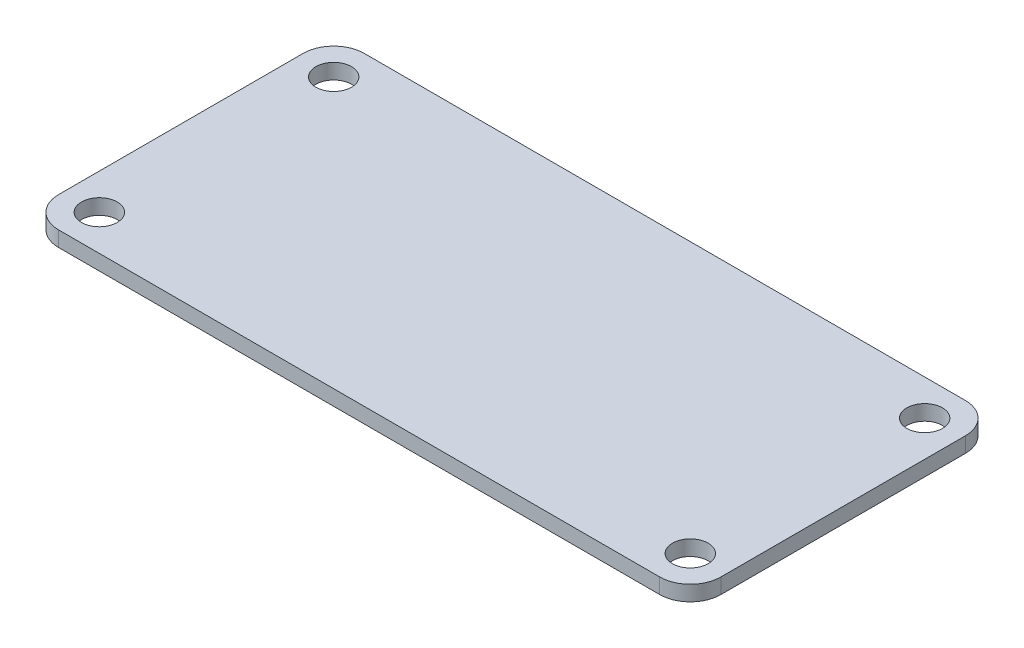
ISO-10303-21;
HEADER;
FILE_DESCRIPTION(('STEP AP214'),'2;1');
FILE_NAME('part.step','',(''),(''),'','','');
FILE_SCHEMA(('AUTOMOTIVE_DESIGN { 1 0 10303 214 1 1 1 1 }'));
ENDSEC;
DATA;
#1=APPLICATION_CONTEXT('core data for automotive mechanical design processes');
#2=APPLICATION_PROTOCOL_DEFINITION('international standard','automotive_design',2000,#1);
#3=PRODUCT_CONTEXT('',#1,'mechanical');
#4=PRODUCT('Part','Part','',(#3));
#5=PRODUCT_RELATED_PRODUCT_CATEGORY('part','',(#4));
#6=PRODUCT_DEFINITION_FORMATION('','',#4);
#7=PRODUCT_DEFINITION_CONTEXT('part definition',#1,'design');
#8=PRODUCT_DEFINITION('design','',#6,#7);
#9=PRODUCT_DEFINITION_SHAPE('','',#8);
#10=(LENGTH_UNIT() NAMED_UNIT(*) SI_UNIT(.MILLI.,.METRE.));
#11=(NAMED_UNIT(*) PLANE_ANGLE_UNIT() SI_UNIT($,.RADIAN.));
#12=(NAMED_UNIT(*) SI_UNIT($,.STERADIAN.) SOLID_ANGLE_UNIT());
#13=UNCERTAINTY_MEASURE_WITH_UNIT(LENGTH_MEASURE(1.E-05),#10,'distance_accuracy_value','');
#14=(GEOMETRIC_REPRESENTATION_CONTEXT(3) GLOBAL_UNCERTAINTY_ASSIGNED_CONTEXT((#13)) GLOBAL_UNIT_ASSIGNED_CONTEXT((#10,
#11,#12)) REPRESENTATION_CONTEXT('',''));
#15=CARTESIAN_POINT('',(0.,0.,0.));
#16=DIRECTION('',(0.,0.,1.));
#17=DIRECTION('',(1.,0.,0.));
#18=AXIS2_PLACEMENT_3D('',#15,#16,#17);
#19=CARTESIAN_POINT('',(0.,1.5,0.));
#20=DIRECTION('',(0.,1.,0.));
#21=DIRECTION('',(0.,0.,1.));
#22=AXIS2_PLACEMENT_3D('',#19,#20,#21);
#23=PLANE('',#22);
#24=CARTESIAN_POINT('',(29.,1.5,11.5));
#25=DIRECTION('',(0.,1.,0.));
#26=DIRECTION('',(0.,0.,1.));
#27=AXIS2_PLACEMENT_3D('',#24,#25,#26);
#28=CIRCLE('',#27,1.75);
#29=CARTESIAN_POINT('',(29.,1.5,13.25));
#30=VERTEX_POINT('',#29);
#31=EDGE_CURVE('E194',#30,#30,#28,.T.);
#32=ORIENTED_EDGE('',*,*,#31,.F.);
#33=EDGE_LOOP('',(#32));
#34=FACE_BOUND('',#33,.T.);
#35=CARTESIAN_POINT('',(-29.,1.5,-11.5));
#36=DIRECTION('',(0.,1.,0.));
#37=DIRECTION('',(0.,0.,1.));
#38=AXIS2_PLACEMENT_3D('',#35,#36,#37);
#39=CIRCLE('',#38,1.75);
#40=CARTESIAN_POINT('',(-29.,1.5,-9.75));
#41=VERTEX_POINT('',#40);
#42=EDGE_CURVE('E184',#41,#41,#39,.T.);
#43=ORIENTED_EDGE('',*,*,#42,.F.);
#44=EDGE_LOOP('',(#43));
#45=FACE_BOUND('',#44,.T.);
#46=DIRECTION('',(-1.,0.,0.));
#47=VECTOR('',#46,1.);
#48=CARTESIAN_POINT('',(-32.5,1.5,-15.));
#49=LINE('',#48,#47);
#50=CARTESIAN_POINT('',(29.5,1.5,-15.));
#51=VERTEX_POINT('',#50);
#52=CARTESIAN_POINT('',(-29.5,1.5,-15.));
#53=VERTEX_POINT('',#52);
#54=EDGE_CURVE('E175',#51,#53,#49,.T.);
#55=ORIENTED_EDGE('',*,*,#54,.T.);
#56=CARTESIAN_POINT('',(-29.5,1.5,-12.));
#57=DIRECTION('',(0.,1.,0.));
#58=DIRECTION('',(0.,0.,1.));
#59=AXIS2_PLACEMENT_3D('',#56,#57,#58);
#60=CIRCLE('',#59,3.);
#61=CARTESIAN_POINT('',(-32.5,1.5,-12.));
#62=VERTEX_POINT('',#61);
#63=EDGE_CURVE('E153',#53,#62,#60,.T.);
#64=ORIENTED_EDGE('',*,*,#63,.T.);
#65=DIRECTION('',(0.,0.,1.));
#66=VECTOR('',#65,1.);
#67=CARTESIAN_POINT('',(-32.5,1.5,-15.));
#68=LINE('',#67,#66);
#69=CARTESIAN_POINT('',(-32.5,1.5,12.));
#70=VERTEX_POINT('',#69);
#71=EDGE_CURVE('E123',#62,#70,#68,.T.);
#72=ORIENTED_EDGE('',*,*,#71,.T.);
#73=CARTESIAN_POINT('',(-29.5,1.5,12.));
#74=DIRECTION('',(0.,1.,0.));
#75=DIRECTION('',(0.,0.,1.));
#76=AXIS2_PLACEMENT_3D('',#73,#74,#75);
#77=CIRCLE('',#76,3.);
#78=CARTESIAN_POINT('',(-29.5,1.5,15.));
#79=VERTEX_POINT('',#78);
#80=EDGE_CURVE('E59',#70,#79,#77,.T.);
#81=ORIENTED_EDGE('',*,*,#80,.T.);
#82=DIRECTION('',(1.,0.,0.));
#83=VECTOR('',#82,1.);
#84=CARTESIAN_POINT('',(-32.5,1.5,15.));
#85=LINE('',#84,#83);
#86=CARTESIAN_POINT('',(29.5,1.5,15.));
#87=VERTEX_POINT('',#86);
#88=EDGE_CURVE('E139',#79,#87,#85,.T.);
#89=ORIENTED_EDGE('',*,*,#88,.T.);
#90=CARTESIAN_POINT('',(29.5,1.5,12.));
#91=DIRECTION('',(0.,1.,0.));
#92=DIRECTION('',(0.,0.,1.));
#93=AXIS2_PLACEMENT_3D('',#90,#91,#92);
#94=CIRCLE('',#93,3.);
#95=CARTESIAN_POINT('',(32.5,1.5,12.));
#96=VERTEX_POINT('',#95);
#97=EDGE_CURVE('E149',#87,#96,#94,.T.);
#98=ORIENTED_EDGE('',*,*,#97,.T.);
#99=DIRECTION('',(0.,0.,-1.));
#100=VECTOR('',#99,1.);
#101=CARTESIAN_POINT('',(32.5,1.5,-15.));
#102=LINE('',#101,#100);
#103=CARTESIAN_POINT('',(32.5,1.5,-12.));
#104=VERTEX_POINT('',#103);
#105=EDGE_CURVE('E133',#96,#104,#102,.T.);
#106=ORIENTED_EDGE('',*,*,#105,.T.);
#107=CARTESIAN_POINT('',(29.5,1.5,-12.));
#108=DIRECTION('',(0.,1.,0.));
#109=DIRECTION('',(0.,0.,1.));
#110=AXIS2_PLACEMENT_3D('',#107,#108,#109);
#111=CIRCLE('',#110,3.);
#112=EDGE_CURVE('E151',#104,#51,#111,.T.);
#113=ORIENTED_EDGE('',*,*,#112,.T.);
#114=EDGE_LOOP('',(#55,#64,#72,#81,#89,#98,#106,#113));
#115=FACE_BOUND('',#114,.T.);
#116=CARTESIAN_POINT('',(29.,1.5,-11.5));
#117=DIRECTION('',(0.,1.,0.));
#118=DIRECTION('',(0.,0.,-1.));
#119=AXIS2_PLACEMENT_3D('',#116,#117,#118);
#120=CIRCLE('',#119,1.75);
#121=CARTESIAN_POINT('',(29.,1.5,-13.25));
#122=VERTEX_POINT('',#121);
#123=EDGE_CURVE('E189',#122,#122,#120,.T.);
#124=ORIENTED_EDGE('',*,*,#123,.F.);
#125=EDGE_LOOP('',(#124));
#126=FACE_BOUND('',#125,.T.);
#127=CARTESIAN_POINT('',(-29.,1.5,11.5));
#128=DIRECTION('',(0.,1.,0.));
#129=DIRECTION('',(0.,0.,-1.));
#130=AXIS2_PLACEMENT_3D('',#127,#128,#129);
#131=CIRCLE('',#130,1.75);
#132=CARTESIAN_POINT('',(-29.,1.5,9.75));
#133=VERTEX_POINT('',#132);
#134=EDGE_CURVE('E200',#133,#133,#131,.T.);
#135=ORIENTED_EDGE('',*,*,#134,.F.);
#136=EDGE_LOOP('',(#135));
#137=FACE_BOUND('',#136,.T.);
#138=ADVANCED_FACE('F39',(#34,#45,#115,#126,#137),#23,.T.);
#139=CARTESIAN_POINT('',(0.,0.,0.));
#140=DIRECTION('',(0.,1.,0.));
#141=DIRECTION('',(0.,0.,1.));
#142=AXIS2_PLACEMENT_3D('',#139,#140,#141);
#143=PLANE('',#142);
#144=DIRECTION('',(0.,0.,1.));
#145=VECTOR('',#144,1.);
#146=CARTESIAN_POINT('',(-32.5,0.,-15.));
#147=LINE('',#146,#145);
#148=CARTESIAN_POINT('',(-32.5,0.,-12.));
#149=VERTEX_POINT('',#148);
#150=CARTESIAN_POINT('',(-32.5,0.,12.));
#151=VERTEX_POINT('',#150);
#152=EDGE_CURVE('E121',#149,#151,#147,.T.);
#153=ORIENTED_EDGE('',*,*,#152,.F.);
#154=CARTESIAN_POINT('',(-29.5,0.,-12.));
#155=DIRECTION('',(0.,1.,0.));
#156=DIRECTION('',(0.,0.,1.));
#157=AXIS2_PLACEMENT_3D('',#154,#155,#156);
#158=CIRCLE('',#157,3.);
#159=CARTESIAN_POINT('',(-29.5,0.,-15.));
#160=VERTEX_POINT('',#159);
#161=EDGE_CURVE('E104',#149,#160,#158,.F.);
#162=ORIENTED_EDGE('',*,*,#161,.T.);
#163=DIRECTION('',(-1.,0.,0.));
#164=VECTOR('',#163,1.);
#165=CARTESIAN_POINT('',(-32.5,0.,-15.));
#166=LINE('',#165,#164);
#167=CARTESIAN_POINT('',(29.5,0.,-15.));
#168=VERTEX_POINT('',#167);
#169=EDGE_CURVE('E131',#168,#160,#166,.T.);
#170=ORIENTED_EDGE('',*,*,#169,.F.);
#171=CARTESIAN_POINT('',(29.5,0.,-12.));
#172=DIRECTION('',(0.,1.,0.));
#173=DIRECTION('',(0.,0.,1.));
#174=AXIS2_PLACEMENT_3D('',#171,#172,#173);
#175=CIRCLE('',#174,3.);
#176=CARTESIAN_POINT('',(32.5,0.,-12.));
#177=VERTEX_POINT('',#176);
#178=EDGE_CURVE('E115',#168,#177,#175,.F.);
#179=ORIENTED_EDGE('',*,*,#178,.T.);
#180=DIRECTION('',(0.,0.,-1.));
#181=VECTOR('',#180,1.);
#182=CARTESIAN_POINT('',(32.5,0.,-15.));
#183=LINE('',#182,#181);
#184=CARTESIAN_POINT('',(32.5,0.,12.));
#185=VERTEX_POINT('',#184);
#186=EDGE_CURVE('E135',#185,#177,#183,.T.);
#187=ORIENTED_EDGE('',*,*,#186,.F.);
#188=CARTESIAN_POINT('',(29.5,0.,12.));
#189=DIRECTION('',(0.,1.,0.));
#190=DIRECTION('',(0.,0.,1.));
#191=AXIS2_PLACEMENT_3D('',#188,#189,#190);
#192=CIRCLE('',#191,3.);
#193=CARTESIAN_POINT('',(29.5,0.,15.));
#194=VERTEX_POINT('',#193);
#195=EDGE_CURVE('E142',#185,#194,#192,.F.);
#196=ORIENTED_EDGE('',*,*,#195,.T.);
#197=DIRECTION('',(1.,0.,0.));
#198=VECTOR('',#197,1.);
#199=CARTESIAN_POINT('',(-32.5,0.,15.));
#200=LINE('',#199,#198);
#201=CARTESIAN_POINT('',(-29.5,0.,15.));
#202=VERTEX_POINT('',#201);
#203=EDGE_CURVE('E130',#202,#194,#200,.T.);
#204=ORIENTED_EDGE('',*,*,#203,.F.);
#205=CARTESIAN_POINT('',(-29.5,0.,12.));
#206=DIRECTION('',(0.,1.,0.));
#207=DIRECTION('',(0.,0.,1.));
#208=AXIS2_PLACEMENT_3D('',#205,#206,#207);
#209=CIRCLE('',#208,3.);
#210=EDGE_CURVE('E124',#202,#151,#209,.F.);
#211=ORIENTED_EDGE('',*,*,#210,.T.);
#212=EDGE_LOOP('',(#153,#162,#170,#179,#187,#196,#204,#211));
#213=FACE_BOUND('',#212,.T.);
#214=CARTESIAN_POINT('',(-29.,0.,-11.5));
#215=DIRECTION('',(0.,1.,0.));
#216=DIRECTION('',(0.,0.,1.));
#217=AXIS2_PLACEMENT_3D('',#214,#215,#216);
#218=CIRCLE('',#217,1.75);
#219=CARTESIAN_POINT('',(-29.,0.,-9.75));
#220=VERTEX_POINT('',#219);
#221=EDGE_CURVE('E180',#220,#220,#218,.T.);
#222=ORIENTED_EDGE('',*,*,#221,.T.);
#223=EDGE_LOOP('',(#222));
#224=FACE_BOUND('',#223,.T.);
#225=CARTESIAN_POINT('',(29.,0.,-11.5));
#226=DIRECTION('',(0.,1.,0.));
#227=DIRECTION('',(0.,0.,-1.));
#228=AXIS2_PLACEMENT_3D('',#225,#226,#227);
#229=CIRCLE('',#228,1.75);
#230=CARTESIAN_POINT('',(29.,0.,-13.25));
#231=VERTEX_POINT('',#230);
#232=EDGE_CURVE('E191',#231,#231,#229,.T.);
#233=ORIENTED_EDGE('',*,*,#232,.T.);
#234=EDGE_LOOP('',(#233));
#235=FACE_BOUND('',#234,.T.);
#236=CARTESIAN_POINT('',(29.,0.,11.5));
#237=DIRECTION('',(0.,1.,0.));
#238=DIRECTION('',(0.,0.,1.));
#239=AXIS2_PLACEMENT_3D('',#236,#237,#238);
#240=CIRCLE('',#239,1.75);
#241=CARTESIAN_POINT('',(29.,0.,13.25));
#242=VERTEX_POINT('',#241);
#243=EDGE_CURVE('E197',#242,#242,#240,.T.);
#244=ORIENTED_EDGE('',*,*,#243,.T.);
#245=EDGE_LOOP('',(#244));
#246=FACE_BOUND('',#245,.T.);
#247=CARTESIAN_POINT('',(-29.,0.,11.5));
#248=DIRECTION('',(0.,1.,0.));
#249=DIRECTION('',(0.,0.,-1.));
#250=AXIS2_PLACEMENT_3D('',#247,#248,#249);
#251=CIRCLE('',#250,1.75);
#252=CARTESIAN_POINT('',(-29.,0.,9.75));
#253=VERTEX_POINT('',#252);
#254=EDGE_CURVE('E203',#253,#253,#251,.T.);
#255=ORIENTED_EDGE('',*,*,#254,.T.);
#256=EDGE_LOOP('',(#255));
#257=FACE_BOUND('',#256,.T.);
#258=ADVANCED_FACE('F127',(#213,#224,#235,#246,#257),#143,.F.);
#259=CARTESIAN_POINT('',(32.5,1.5,-15.));
#260=DIRECTION('',(-1.,0.,0.));
#261=DIRECTION('',(0.,0.,1.));
#262=AXIS2_PLACEMENT_3D('',#259,#260,#261);
#263=PLANE('',#262);
#264=ORIENTED_EDGE('',*,*,#186,.T.);
#265=DIRECTION('',(0.,-1.,0.));
#266=VECTOR('',#265,1.);
#267=CARTESIAN_POINT('',(32.5,1.5,-12.));
#268=LINE('',#267,#266);
#269=EDGE_CURVE('E158',#177,#104,#268,.F.);
#270=ORIENTED_EDGE('',*,*,#269,.T.);
#271=ORIENTED_EDGE('',*,*,#105,.F.);
#272=DIRECTION('',(0.,-1.,0.));
#273=VECTOR('',#272,1.);
#274=CARTESIAN_POINT('',(32.5,1.5,12.));
#275=LINE('',#274,#273);
#276=EDGE_CURVE('E155',#96,#185,#275,.T.);
#277=ORIENTED_EDGE('',*,*,#276,.T.);
#278=EDGE_LOOP('',(#264,#270,#271,#277));
#279=FACE_BOUND('',#278,.T.);
#280=ADVANCED_FACE('F171',(#279),#263,.F.);
#281=CARTESIAN_POINT('',(-32.5,1.5,-15.));
#282=DIRECTION('',(0.,0.,1.));
#283=DIRECTION('',(1.,0.,0.));
#284=AXIS2_PLACEMENT_3D('',#281,#282,#283);
#285=PLANE('',#284);
#286=ORIENTED_EDGE('',*,*,#169,.T.);
#287=DIRECTION('',(0.,-1.,0.));
#288=VECTOR('',#287,1.);
#289=CARTESIAN_POINT('',(-29.5,1.5,-15.));
#290=LINE('',#289,#288);
#291=EDGE_CURVE('E109',#160,#53,#290,.F.);
#292=ORIENTED_EDGE('',*,*,#291,.T.);
#293=ORIENTED_EDGE('',*,*,#54,.F.);
#294=DIRECTION('',(0.,-1.,0.));
#295=VECTOR('',#294,1.);
#296=CARTESIAN_POINT('',(29.5,1.5,-15.));
#297=LINE('',#296,#295);
#298=EDGE_CURVE('E114',#51,#168,#297,.T.);
#299=ORIENTED_EDGE('',*,*,#298,.T.);
#300=EDGE_LOOP('',(#286,#292,#293,#299));
#301=FACE_BOUND('',#300,.T.);
#302=ADVANCED_FACE('F230',(#301),#285,.F.);
#303=CARTESIAN_POINT('',(-32.5,1.5,-15.));
#304=DIRECTION('',(1.,0.,0.));
#305=DIRECTION('',(0.,0.,-1.));
#306=AXIS2_PLACEMENT_3D('',#303,#304,#305);
#307=PLANE('',#306);
#308=ORIENTED_EDGE('',*,*,#71,.F.);
#309=DIRECTION('',(0.,-1.,0.));
#310=VECTOR('',#309,1.);
#311=CARTESIAN_POINT('',(-32.5,1.5,-12.));
#312=LINE('',#311,#310);
#313=EDGE_CURVE('E108',#62,#149,#312,.T.);
#314=ORIENTED_EDGE('',*,*,#313,.T.);
#315=ORIENTED_EDGE('',*,*,#152,.T.);
#316=DIRECTION('',(0.,-1.,0.));
#317=VECTOR('',#316,1.);
#318=CARTESIAN_POINT('',(-32.5,1.5,12.));
#319=LINE('',#318,#317);
#320=EDGE_CURVE('E125',#151,#70,#319,.F.);
#321=ORIENTED_EDGE('',*,*,#320,.T.);
#322=EDGE_LOOP('',(#308,#314,#315,#321));
#323=FACE_BOUND('',#322,.T.);
#324=ADVANCED_FACE('F120',(#323),#307,.F.);
#325=CARTESIAN_POINT('',(-32.5,1.5,15.));
#326=DIRECTION('',(0.,0.,-1.));
#327=DIRECTION('',(-1.,0.,0.));
#328=AXIS2_PLACEMENT_3D('',#325,#326,#327);
#329=PLANE('',#328);
#330=ORIENTED_EDGE('',*,*,#203,.T.);
#331=DIRECTION('',(0.,-1.,0.));
#332=VECTOR('',#331,1.);
#333=CARTESIAN_POINT('',(29.5,1.5,15.));
#334=LINE('',#333,#332);
#335=EDGE_CURVE('E11',#194,#87,#334,.F.);
#336=ORIENTED_EDGE('',*,*,#335,.T.);
#337=ORIENTED_EDGE('',*,*,#88,.F.);
#338=DIRECTION('',(0.,-1.,0.));
#339=VECTOR('',#338,1.);
#340=CARTESIAN_POINT('',(-29.5,1.5,15.));
#341=LINE('',#340,#339);
#342=EDGE_CURVE('E47',#79,#202,#341,.T.);
#343=ORIENTED_EDGE('',*,*,#342,.T.);
#344=EDGE_LOOP('',(#330,#336,#337,#343));
#345=FACE_BOUND('',#344,.T.);
#346=ADVANCED_FACE('F161',(#345),#329,.F.);
#347=CARTESIAN_POINT('',(-29.,1.5,-11.5));
#348=DIRECTION('',(0.,-1.,0.));
#349=DIRECTION('',(0.,0.,-1.));
#350=AXIS2_PLACEMENT_3D('',#347,#348,#349);
#351=CYLINDRICAL_SURFACE('',#350,1.75);
#352=ORIENTED_EDGE('',*,*,#42,.T.);
#353=EDGE_LOOP('',(#352));
#354=FACE_BOUND('',#353,.T.);
#355=ORIENTED_EDGE('',*,*,#221,.F.);
#356=EDGE_LOOP('',(#355));
#357=FACE_BOUND('',#356,.T.);
#358=ADVANCED_FACE('F223',(#354,#357),#351,.F.);
#359=CARTESIAN_POINT('',(29.,1.5,-11.5));
#360=DIRECTION('',(0.,-1.,0.));
#361=DIRECTION('',(0.,0.,-1.));
#362=AXIS2_PLACEMENT_3D('',#359,#360,#361);
#363=CYLINDRICAL_SURFACE('',#362,1.75);
#364=ORIENTED_EDGE('',*,*,#123,.T.);
#365=EDGE_LOOP('',(#364));
#366=FACE_BOUND('',#365,.T.);
#367=ORIENTED_EDGE('',*,*,#232,.F.);
#368=EDGE_LOOP('',(#367));
#369=FACE_BOUND('',#368,.T.);
#370=ADVANCED_FACE('F252',(#366,#369),#363,.F.);
#371=CARTESIAN_POINT('',(29.,1.5,11.5));
#372=DIRECTION('',(0.,-1.,0.));
#373=DIRECTION('',(0.,0.,-1.));
#374=AXIS2_PLACEMENT_3D('',#371,#372,#373);
#375=CYLINDRICAL_SURFACE('',#374,1.75);
#376=ORIENTED_EDGE('',*,*,#31,.T.);
#377=EDGE_LOOP('',(#376));
#378=FACE_BOUND('',#377,.T.);
#379=ORIENTED_EDGE('',*,*,#243,.F.);
#380=EDGE_LOOP('',(#379));
#381=FACE_BOUND('',#380,.T.);
#382=ADVANCED_FACE('F255',(#378,#381),#375,.F.);
#383=CARTESIAN_POINT('',(-29.,1.5,11.5));
#384=DIRECTION('',(0.,-1.,0.));
#385=DIRECTION('',(0.,0.,-1.));
#386=AXIS2_PLACEMENT_3D('',#383,#384,#385);
#387=CYLINDRICAL_SURFACE('',#386,1.75);
#388=ORIENTED_EDGE('',*,*,#134,.T.);
#389=EDGE_LOOP('',(#388));
#390=FACE_BOUND('',#389,.T.);
#391=ORIENTED_EDGE('',*,*,#254,.F.);
#392=EDGE_LOOP('',(#391));
#393=FACE_BOUND('',#392,.T.);
#394=ADVANCED_FACE('F209',(#390,#393),#387,.F.);
#395=CARTESIAN_POINT('',(-29.5,1.5,-12.));
#396=DIRECTION('',(0.,-1.,0.));
#397=DIRECTION('',(0.,0.,-1.));
#398=AXIS2_PLACEMENT_3D('',#395,#396,#397);
#399=CYLINDRICAL_SURFACE('',#398,3.);
#400=ORIENTED_EDGE('',*,*,#63,.F.);
#401=ORIENTED_EDGE('',*,*,#291,.F.);
#402=ORIENTED_EDGE('',*,*,#161,.F.);
#403=ORIENTED_EDGE('',*,*,#313,.F.);
#404=EDGE_LOOP('',(#400,#401,#402,#403));
#405=FACE_BOUND('',#404,.T.);
#406=ADVANCED_FACE('F107',(#405),#399,.T.);
#407=CARTESIAN_POINT('',(29.5,1.5,-12.));
#408=DIRECTION('',(0.,-1.,0.));
#409=DIRECTION('',(0.,0.,-1.));
#410=AXIS2_PLACEMENT_3D('',#407,#408,#409);
#411=CYLINDRICAL_SURFACE('',#410,3.);
#412=ORIENTED_EDGE('',*,*,#112,.F.);
#413=ORIENTED_EDGE('',*,*,#269,.F.);
#414=ORIENTED_EDGE('',*,*,#178,.F.);
#415=ORIENTED_EDGE('',*,*,#298,.F.);
#416=EDGE_LOOP('',(#412,#413,#414,#415));
#417=FACE_BOUND('',#416,.T.);
#418=ADVANCED_FACE('F238',(#417),#411,.T.);
#419=CARTESIAN_POINT('',(29.5,1.5,12.));
#420=DIRECTION('',(0.,-1.,0.));
#421=DIRECTION('',(0.,0.,-1.));
#422=AXIS2_PLACEMENT_3D('',#419,#420,#421);
#423=CYLINDRICAL_SURFACE('',#422,3.);
#424=ORIENTED_EDGE('',*,*,#97,.F.);
#425=ORIENTED_EDGE('',*,*,#335,.F.);
#426=ORIENTED_EDGE('',*,*,#195,.F.);
#427=ORIENTED_EDGE('',*,*,#276,.F.);
#428=EDGE_LOOP('',(#424,#425,#426,#427));
#429=FACE_BOUND('',#428,.T.);
#430=ADVANCED_FACE('F168',(#429),#423,.T.);
#431=CARTESIAN_POINT('',(-29.5,1.5,12.));
#432=DIRECTION('',(0.,-1.,0.));
#433=DIRECTION('',(0.,0.,-1.));
#434=AXIS2_PLACEMENT_3D('',#431,#432,#433);
#435=CYLINDRICAL_SURFACE('',#434,3.);
#436=ORIENTED_EDGE('',*,*,#80,.F.);
#437=ORIENTED_EDGE('',*,*,#320,.F.);
#438=ORIENTED_EDGE('',*,*,#210,.F.);
#439=ORIENTED_EDGE('',*,*,#342,.F.);
#440=EDGE_LOOP('',(#436,#437,#438,#439));
#441=FACE_BOUND('',#440,.T.);
#442=ADVANCED_FACE('F41',(#441),#435,.T.);
#443=CLOSED_SHELL('',(#138,#258,#280,#302,#324,#346,#358,#370,#382,#394,#406,#418,#430,#442));
#444=MANIFOLD_SOLID_BREP('B2',#443);
#445=ADVANCED_BREP_SHAPE_REPRESENTATION('',(#18,#444),#14);
#446=SHAPE_DEFINITION_REPRESENTATION(#9,#445);
ENDSEC;
END-ISO-10303-21;
